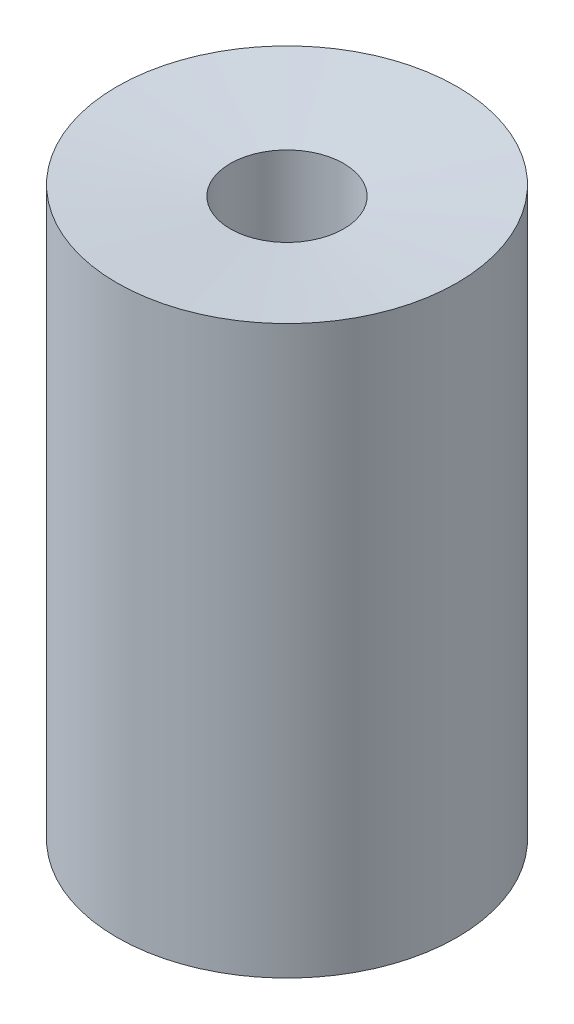
ISO-10303-21;
HEADER;
FILE_DESCRIPTION(('STEP AP214'),'2;1');
FILE_NAME('part.step','',(''),(''),'','','');
FILE_SCHEMA(('AUTOMOTIVE_DESIGN { 1 0 10303 214 1 1 1 1 }'));
ENDSEC;
DATA;
#1=APPLICATION_CONTEXT('core data for automotive mechanical design processes');
#2=APPLICATION_PROTOCOL_DEFINITION('international standard','automotive_design',2000,#1);
#3=PRODUCT_CONTEXT('',#1,'mechanical');
#4=PRODUCT('Part','Part','',(#3));
#5=PRODUCT_RELATED_PRODUCT_CATEGORY('part','',(#4));
#6=PRODUCT_DEFINITION_FORMATION('','',#4);
#7=PRODUCT_DEFINITION_CONTEXT('part definition',#1,'design');
#8=PRODUCT_DEFINITION('design','',#6,#7);
#9=PRODUCT_DEFINITION_SHAPE('','',#8);
#10=(LENGTH_UNIT() NAMED_UNIT(*) SI_UNIT(.MILLI.,.METRE.));
#11=(NAMED_UNIT(*) PLANE_ANGLE_UNIT() SI_UNIT($,.RADIAN.));
#12=(NAMED_UNIT(*) SI_UNIT($,.STERADIAN.) SOLID_ANGLE_UNIT());
#13=UNCERTAINTY_MEASURE_WITH_UNIT(LENGTH_MEASURE(1.E-05),#10,'distance_accuracy_value','');
#14=(GEOMETRIC_REPRESENTATION_CONTEXT(3) GLOBAL_UNCERTAINTY_ASSIGNED_CONTEXT((#13)) GLOBAL_UNIT_ASSIGNED_CONTEXT((#10,
#11,#12)) REPRESENTATION_CONTEXT('',''));
#15=CARTESIAN_POINT('',(0.,0.,0.));
#16=DIRECTION('',(0.,0.,1.));
#17=DIRECTION('',(1.,0.,0.));
#18=AXIS2_PLACEMENT_3D('',#15,#16,#17);
#19=CARTESIAN_POINT('',(0.,100.,0.));
#20=DIRECTION('',(0.,-1.,0.));
#21=DIRECTION('',(0.,0.,-1.));
#22=AXIS2_PLACEMENT_3D('',#19,#20,#21);
#23=CYLINDRICAL_SURFACE('',#22,10.);
#24=CARTESIAN_POINT('',(0.,98.2502267294817,0.));
#25=DIRECTION('',(0.,1.,0.));
#26=DIRECTION('',(0.,0.,1.));
#27=AXIS2_PLACEMENT_3D('',#24,#25,#26);
#28=CIRCLE('',#27,10.);
#29=CARTESIAN_POINT('',(0.,98.2502267294817,9.99999999999998));
#30=VERTEX_POINT('',#29);
#31=EDGE_CURVE('E10',#30,#30,#28,.T.);
#32=ORIENTED_EDGE('',*,*,#31,.T.);
#33=EDGE_LOOP('',(#32));
#34=FACE_BOUND('',#33,.T.);
#35=CARTESIAN_POINT('',(0.,1.74977327051833,0.));
#36=DIRECTION('',(0.,-1.,0.));
#37=DIRECTION('',(0.,0.,-1.));
#38=AXIS2_PLACEMENT_3D('',#35,#36,#37);
#39=CIRCLE('',#38,10.);
#40=CARTESIAN_POINT('',(0.,1.74977327051833,-9.99999999999999));
#41=VERTEX_POINT('',#40);
#42=EDGE_CURVE('E42',#41,#41,#39,.T.);
#43=ORIENTED_EDGE('',*,*,#42,.T.);
#44=EDGE_LOOP('',(#43));
#45=FACE_BOUND('',#44,.T.);
#46=ADVANCED_FACE('F31',(#34,#45),#23,.F.);
#47=CARTESIAN_POINT('',(0.,100.,0.));
#48=DIRECTION('',(0.,-1.,0.));
#49=DIRECTION('',(0.,0.,-1.));
#50=AXIS2_PLACEMENT_3D('',#47,#48,#49);
#51=CYLINDRICAL_SURFACE('',#50,30.);
#52=CARTESIAN_POINT('',(0.,100.,0.));
#53=DIRECTION('',(0.,-1.,0.));
#54=DIRECTION('',(0.,0.,-1.));
#55=AXIS2_PLACEMENT_3D('',#52,#53,#54);
#56=CIRCLE('',#55,30.);
#57=CARTESIAN_POINT('',(0.,100.,30.0000000000001));
#58=VERTEX_POINT('',#57);
#59=EDGE_CURVE('E38',#58,#58,#56,.T.);
#60=ORIENTED_EDGE('',*,*,#59,.T.);
#61=EDGE_LOOP('',(#60));
#62=FACE_BOUND('',#61,.T.);
#63=CARTESIAN_POINT('',(0.,0.,0.));
#64=DIRECTION('',(0.,-1.,0.));
#65=DIRECTION('',(0.,0.,-1.));
#66=AXIS2_PLACEMENT_3D('',#63,#64,#65);
#67=CIRCLE('',#66,30.);
#68=CARTESIAN_POINT('',(0.,0.,-30.));
#69=VERTEX_POINT('',#68);
#70=EDGE_CURVE('E46',#69,#69,#67,.T.);
#71=ORIENTED_EDGE('',*,*,#70,.F.);
#72=EDGE_LOOP('',(#71));
#73=FACE_BOUND('',#72,.T.);
#74=ADVANCED_FACE('F33',(#62,#73),#51,.T.);
#75=CARTESIAN_POINT('',(0.,100.,0.));
#76=DIRECTION('',(0.,1.,0.));
#77=DIRECTION('',(0.,0.,1.));
#78=AXIS2_PLACEMENT_3D('',#75,#76,#77);
#79=CONICAL_SURFACE('',#78,30.,1.48352986419519);
#80=CARTESIAN_POINT('',(0.,98.2502267294817,9.99999999999998));
#81=CARTESIAN_POINT('',(0.,98.2684535343829,10.2083333333333));
#82=CARTESIAN_POINT('',(0.,98.2866803392841,10.4166666666667));
#83=CARTESIAN_POINT('',(0.,98.3231339490866,10.8333333333333));
#84=CARTESIAN_POINT('',(0.,98.3413607539878,11.0416666666667));
#85=CARTESIAN_POINT('',(0.,98.3778143637903,11.4583333333333));
#86=CARTESIAN_POINT('',(0.,98.3960411686915,11.6666666666667));
#87=CARTESIAN_POINT('',(0.,98.432494778494,12.0833333333333));
#88=CARTESIAN_POINT('',(0.,98.4507215833952,12.2916666666667));
#89=CARTESIAN_POINT('',(0.,98.4871751931977,12.7083333333333));
#90=CARTESIAN_POINT('',(0.,98.5054019980989,12.9166666666667));
#91=CARTESIAN_POINT('',(0.,98.5418556079014,13.3333333333333));
#92=CARTESIAN_POINT('',(0.,98.5600824128026,13.5416666666667));
#93=CARTESIAN_POINT('',(0.,98.5965360226051,13.9583333333333));
#94=CARTESIAN_POINT('',(0.,98.6147628275063,14.1666666666667));
#95=CARTESIAN_POINT('',(0.,98.6512164373088,14.5833333333333));
#96=CARTESIAN_POINT('',(0.,98.66944324221,14.7916666666667));
#97=CARTESIAN_POINT('',(0.,98.7058968520125,15.2083333333333));
#98=CARTESIAN_POINT('',(0.,98.7241236569137,15.4166666666667));
#99=CARTESIAN_POINT('',(0.,98.7605772667162,15.8333333333333));
#100=CARTESIAN_POINT('',(0.,98.7788040716174,16.0416666666667));
#101=CARTESIAN_POINT('',(0.,98.8152576814199,16.4583333333333));
#102=CARTESIAN_POINT('',(0.,98.8334844863211,16.6666666666667));
#103=CARTESIAN_POINT('',(0.,98.8699380961236,17.0833333333333));
#104=CARTESIAN_POINT('',(0.,98.8881649010248,17.2916666666667));
#105=CARTESIAN_POINT('',(0.,98.9246185108273,17.7083333333334));
#106=CARTESIAN_POINT('',(0.,98.9428453157285,17.9166666666667));
#107=CARTESIAN_POINT('',(0.,98.979298925531,18.3333333333334));
#108=CARTESIAN_POINT('',(0.,98.9975257304322,18.5416666666667));
#109=CARTESIAN_POINT('',(0.,99.0339793402347,18.9583333333334));
#110=CARTESIAN_POINT('',(0.,99.0522061451359,19.1666666666667));
#111=CARTESIAN_POINT('',(0.,99.0886597549384,19.5833333333334));
#112=CARTESIAN_POINT('',(0.,99.1068865598396,19.7916666666667));
#113=CARTESIAN_POINT('',(0.,99.1433401696421,20.2083333333334));
#114=CARTESIAN_POINT('',(0.,99.1615669745433,20.4166666666667));
#115=CARTESIAN_POINT('',(0.,99.1980205843458,20.8333333333334));
#116=CARTESIAN_POINT('',(0.,99.216247389247,21.0416666666667));
#117=CARTESIAN_POINT('',(0.,99.2527009990495,21.4583333333334));
#118=CARTESIAN_POINT('',(0.,99.2709278039507,21.6666666666667));
#119=CARTESIAN_POINT('',(0.,99.3073814137532,22.0833333333334));
#120=CARTESIAN_POINT('',(0.,99.3256082186544,22.2916666666667));
#121=CARTESIAN_POINT('',(0.,99.3620618284569,22.7083333333334));
#122=CARTESIAN_POINT('',(0.,99.3802886333581,22.9166666666667));
#123=CARTESIAN_POINT('',(0.,99.4167422431606,23.3333333333334));
#124=CARTESIAN_POINT('',(0.,99.4349690480618,23.5416666666667));
#125=CARTESIAN_POINT('',(0.,99.4714226578643,23.9583333333334));
#126=CARTESIAN_POINT('',(0.,99.4896494627655,24.1666666666667));
#127=CARTESIAN_POINT('',(0.,99.526103072568,24.5833333333334));
#128=CARTESIAN_POINT('',(0.,99.5443298774692,24.7916666666667));
#129=CARTESIAN_POINT('',(0.,99.5807834872717,25.2083333333334));
#130=CARTESIAN_POINT('',(0.,99.5990102921729,25.4166666666667));
#131=CARTESIAN_POINT('',(0.,99.6354639019754,25.8333333333334));
#132=CARTESIAN_POINT('',(0.,99.6536907068766,26.0416666666667));
#133=CARTESIAN_POINT('',(0.,99.6901443166791,26.4583333333334));
#134=CARTESIAN_POINT('',(0.,99.7083711215803,26.6666666666667));
#135=CARTESIAN_POINT('',(0.,99.7448247313827,27.0833333333334));
#136=CARTESIAN_POINT('',(0.,99.763051536284,27.2916666666667));
#137=CARTESIAN_POINT('',(0.,99.7995051460865,27.7083333333334));
#138=CARTESIAN_POINT('',(0.,99.8177319509877,27.9166666666667));
#139=CARTESIAN_POINT('',(0.,99.8541855607901,28.3333333333334));
#140=CARTESIAN_POINT('',(0.,99.8724123656914,28.5416666666667));
#141=CARTESIAN_POINT('',(0.,99.9088659754938,28.9583333333334));
#142=CARTESIAN_POINT('',(0.,99.9270927803951,29.1666666666667));
#143=CARTESIAN_POINT('',(0.,99.9635463901975,29.5833333333334));
#144=CARTESIAN_POINT('',(0.,99.9817731950988,29.7916666666667));
#145=CARTESIAN_POINT('',(0.,100.,30.0000000000001));
#146=B_SPLINE_CURVE_WITH_KNOTS('',3,(#80,#81,#82,#83,#84,#85,#86,#87,#88,#89,#90,#91,#92,#93,
#94,#95,#96,#97,#98,#99,#100,#101,#102,#103,#104,#105,#106,#107,#108,#109,#110,#111,#112,#113,
#114,#115,#116,#117,#118,#119,#120,#121,#122,#123,#124,#125,#126,#127,#128,#129,#130,#131,#132,
#133,#134,#135,#136,#137,#138,#139,#140,#141,#142,#143,#144,#145),.UNSPECIFIED.,.F.,.F.,(4,2,2,
2,2,2,2,2,2,2,2,2,2,2,2,2,2,2,2,2,2,2,2,2,2,2,2,2,2,2,2,2,4),(0.,0.627387398464593,
1.25477479692919,1.88216219539378,2.50954959385838,3.13693699232297,3.76432439078757,
4.39171178925216,5.01909918771676,5.64648658618135,6.27387398464595,6.90126138311054,
7.52864878157514,8.15603618003973,8.78342357850432,9.41081097696892,10.0381983754335,
10.6655857738981,11.2929731723627,11.9203605708273,12.5477479692919,13.1751353677565,
13.8025227662211,14.4299101646857,15.0572975631503,15.6846849616149,16.3120723600795,
16.9394597585441,17.5668471570086,18.1942345554732,18.8216219539378,19.4490093524024,
20.076396750867),.UNSPECIFIED.);
#147=EDGE_CURVE('BSEAM55',#30,#58,#146,.T.);
#148=ORIENTED_EDGE('',*,*,#31,.F.);
#149=ORIENTED_EDGE('',*,*,#59,.F.);
#150=ORIENTED_EDGE('',*,*,#147,.T.);
#151=ORIENTED_EDGE('',*,*,#147,.F.);
#152=EDGE_LOOP('',(#148,#150,#149,#151));
#153=FACE_BOUND('',#152,.T.);
#154=ADVANCED_FACE('F55',(#153),#79,.F.);
#155=CARTESIAN_POINT('',(0.,2.6246599057775,0.));
#156=DIRECTION('',(0.,-1.,0.));
#157=DIRECTION('',(0.,0.,-1.));
#158=AXIS2_PLACEMENT_3D('',#155,#156,#157);
#159=CONICAL_SURFACE('',#158,0.,1.48352986419519);
#160=CARTESIAN_POINT('',(0.,1.74977327051833,-9.99999999999999));
#161=CARTESIAN_POINT('',(0.,1.7315464656171,-10.2083333333333));
#162=CARTESIAN_POINT('',(0.,1.71331966071587,-10.4166666666667));
#163=CARTESIAN_POINT('',(0.,1.6768660509134,-10.8333333333333));
#164=CARTESIAN_POINT('',(0.,1.65863924601217,-11.0416666666667));
#165=CARTESIAN_POINT('',(0.,1.6221856362097,-11.4583333333333));
#166=CARTESIAN_POINT('',(0.,1.60395883130847,-11.6666666666667));
#167=CARTESIAN_POINT('',(0.,1.567505221506,-12.0833333333333));
#168=CARTESIAN_POINT('',(0.,1.54927841660477,-12.2916666666667));
#169=CARTESIAN_POINT('',(0.,1.51282480680231,-12.7083333333333));
#170=CARTESIAN_POINT('',(0.,1.49459800190107,-12.9166666666667));
#171=CARTESIAN_POINT('',(0.,1.45814439209861,-13.3333333333333));
#172=CARTESIAN_POINT('',(0.,1.43991758719738,-13.5416666666667));
#173=CARTESIAN_POINT('',(0.,1.40346397739491,-13.9583333333333));
#174=CARTESIAN_POINT('',(0.,1.38523717249368,-14.1666666666667));
#175=CARTESIAN_POINT('',(0.,1.34878356269121,-14.5833333333333));
#176=CARTESIAN_POINT('',(0.,1.33055675778998,-14.7916666666667));
#177=CARTESIAN_POINT('',(0.,1.29410314798752,-15.2083333333333));
#178=CARTESIAN_POINT('',(0.,1.27587634308628,-15.4166666666667));
#179=CARTESIAN_POINT('',(0.,1.23942273328382,-15.8333333333333));
#180=CARTESIAN_POINT('',(0.,1.22119592838258,-16.0416666666667));
#181=CARTESIAN_POINT('',(0.,1.18474231858012,-16.4583333333333));
#182=CARTESIAN_POINT('',(0.,1.16651551367889,-16.6666666666667));
#183=CARTESIAN_POINT('',(0.,1.13006190387642,-17.0833333333333));
#184=CARTESIAN_POINT('',(0.,1.11183509897519,-17.2916666666667));
#185=CARTESIAN_POINT('',(0.,1.07538148917272,-17.7083333333333));
#186=CARTESIAN_POINT('',(0.,1.05715468427149,-17.9166666666667));
#187=CARTESIAN_POINT('',(0.,1.02070107446903,-18.3333333333333));
#188=CARTESIAN_POINT('',(0.,1.00247426956779,-18.5416666666667));
#189=CARTESIAN_POINT('',(0.,0.966020659765328,-18.9583333333333));
#190=CARTESIAN_POINT('',(0.,0.947793854864096,-19.1666666666667));
#191=CARTESIAN_POINT('',(0.,0.91134024506163,-19.5833333333333));
#192=CARTESIAN_POINT('',(0.,0.893113440160398,-19.7916666666667));
#193=CARTESIAN_POINT('',(0.,0.856659830357933,-20.2083333333333));
#194=CARTESIAN_POINT('',(0.,0.8384330254567,-20.4166666666667));
#195=CARTESIAN_POINT('',(0.,0.801979415654235,-20.8333333333333));
#196=CARTESIAN_POINT('',(0.,0.783752610753002,-21.0416666666667));
#197=CARTESIAN_POINT('',(0.,0.747299000950537,-21.4583333333333));
#198=CARTESIAN_POINT('',(0.,0.729072196049305,-21.6666666666667));
#199=CARTESIAN_POINT('',(0.,0.692618586246839,-22.0833333333333));
#200=CARTESIAN_POINT('',(0.,0.674391781345607,-22.2916666666667));
#201=CARTESIAN_POINT('',(0.,0.637938171543141,-22.7083333333333));
#202=CARTESIAN_POINT('',(0.,0.619711366641909,-22.9166666666667));
#203=CARTESIAN_POINT('',(0.,0.583257756839444,-23.3333333333333));
#204=CARTESIAN_POINT('',(0.,0.565030951938211,-23.5416666666667));
#205=CARTESIAN_POINT('',(0.,0.528577342135746,-23.9583333333333));
#206=CARTESIAN_POINT('',(0.,0.510350537234513,-24.1666666666667));
#207=CARTESIAN_POINT('',(0.,0.473896927432048,-24.5833333333333));
#208=CARTESIAN_POINT('',(0.,0.455670122530815,-24.7916666666667));
#209=CARTESIAN_POINT('',(0.,0.41921651272835,-25.2083333333333));
#210=CARTESIAN_POINT('',(0.,0.400989707827118,-25.4166666666667));
#211=CARTESIAN_POINT('',(0.,0.364536098024652,-25.8333333333333));
#212=CARTESIAN_POINT('',(0.,0.34630929312342,-26.0416666666667));
#213=CARTESIAN_POINT('',(0.,0.309855683320954,-26.4583333333333));
#214=CARTESIAN_POINT('',(0.,0.291628878419722,-26.6666666666667));
#215=CARTESIAN_POINT('',(0.,0.255175268617256,-27.0833333333333));
#216=CARTESIAN_POINT('',(0.,0.236948463716024,-27.2916666666667));
#217=CARTESIAN_POINT('',(0.,0.200494853913559,-27.7083333333333));
#218=CARTESIAN_POINT('',(0.,0.182268049012326,-27.9166666666667));
#219=CARTESIAN_POINT('',(0.,0.145814439209861,-28.3333333333333));
#220=CARTESIAN_POINT('',(0.,0.127587634308628,-28.5416666666667));
#221=CARTESIAN_POINT('',(0.,0.0911340245061629,-28.9583333333333));
#222=CARTESIAN_POINT('',(0.,0.0729072196049305,-29.1666666666667));
#223=CARTESIAN_POINT('',(0.,0.0364536098024654,-29.5833333333333));
#224=CARTESIAN_POINT('',(0.,0.0182268049012327,-29.7916666666667));
#225=CARTESIAN_POINT('',(0.,0.,-30.));
#226=B_SPLINE_CURVE_WITH_KNOTS('',3,(#160,#161,#162,#163,#164,#165,#166,#167,#168,#169,#170,
#171,#172,#173,#174,#175,#176,#177,#178,#179,#180,#181,#182,#183,#184,#185,#186,#187,#188,#189,
#190,#191,#192,#193,#194,#195,#196,#197,#198,#199,#200,#201,#202,#203,#204,#205,#206,#207,#208,
#209,#210,#211,#212,#213,#214,#215,#216,#217,#218,#219,#220,#221,#222,#223,#224,#225),
.UNSPECIFIED.,.F.,.F.,(4,2,2,2,2,2,2,2,2,2,2,2,2,2,2,2,2,2,2,2,2,2,2,2,2,2,2,2,2,2,2,2,4),(0.,
0.627387398464592,1.25477479692918,1.88216219539378,2.50954959385837,3.13693699232296,
3.76432439078755,4.39171178925214,5.01909918771673,5.64648658618132,6.27387398464592,
6.9012613831105,7.5286487815751,8.15603618003969,8.78342357850428,9.41081097696887,
10.0381983754335,10.6655857738981,11.2929731723627,11.9203605708272,12.5477479692918,
13.1751353677564,13.802522766221,14.4299101646856,15.0572975631502,15.6846849616148,
16.3120723600794,16.939459758544,17.5668471570086,18.1942345554732,18.8216219539377,
19.4490093524023,20.0763967508669),.UNSPECIFIED.);
#227=EDGE_CURVE('BSEAM52',#41,#69,#226,.T.);
#228=ORIENTED_EDGE('',*,*,#42,.F.);
#229=ORIENTED_EDGE('',*,*,#70,.T.);
#230=ORIENTED_EDGE('',*,*,#227,.T.);
#231=ORIENTED_EDGE('',*,*,#227,.F.);
#232=EDGE_LOOP('',(#228,#230,#229,#231));
#233=FACE_BOUND('',#232,.T.);
#234=ADVANCED_FACE('F52',(#233),#159,.F.);
#235=CLOSED_SHELL('',(#46,#74,#154,#234));
#236=MANIFOLD_SOLID_BREP('B2',#235);
#237=ADVANCED_BREP_SHAPE_REPRESENTATION('',(#18,#236),#14);
#238=SHAPE_DEFINITION_REPRESENTATION(#9,#237);
ENDSEC;
END-ISO-10303-21;
